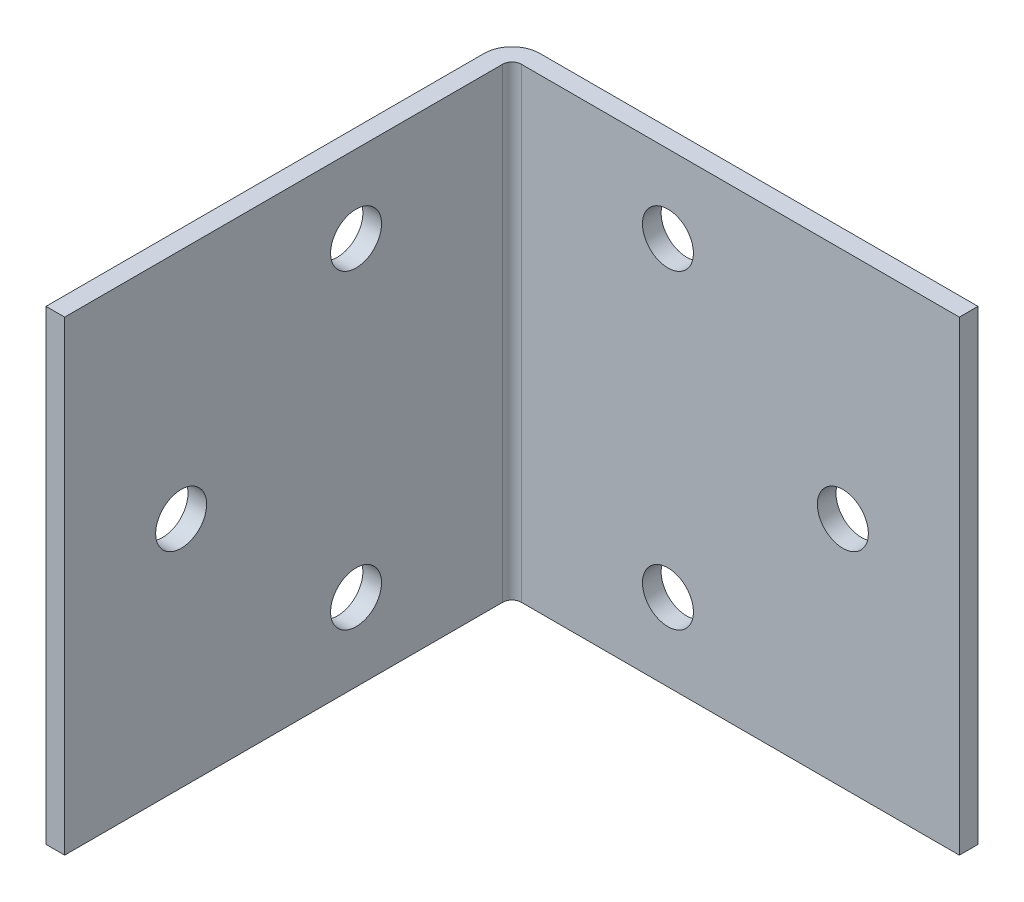
ISO-10303-21;
HEADER;
FILE_DESCRIPTION(('STEP AP214'),'2;1');
FILE_NAME('part.step','',(''),(''),'','','');
FILE_SCHEMA(('AUTOMOTIVE_DESIGN { 1 0 10303 214 1 1 1 1 }'));
ENDSEC;
DATA;
#1=APPLICATION_CONTEXT('core data for automotive mechanical design processes');
#2=APPLICATION_PROTOCOL_DEFINITION('international standard','automotive_design',2000,#1);
#3=PRODUCT_CONTEXT('',#1,'mechanical');
#4=PRODUCT('Part','Part','',(#3));
#5=PRODUCT_RELATED_PRODUCT_CATEGORY('part','',(#4));
#6=PRODUCT_DEFINITION_FORMATION('','',#4);
#7=PRODUCT_DEFINITION_CONTEXT('part definition',#1,'design');
#8=PRODUCT_DEFINITION('design','',#6,#7);
#9=PRODUCT_DEFINITION_SHAPE('','',#8);
#10=(LENGTH_UNIT() NAMED_UNIT(*) SI_UNIT(.MILLI.,.METRE.));
#11=(NAMED_UNIT(*) PLANE_ANGLE_UNIT() SI_UNIT($,.RADIAN.));
#12=(NAMED_UNIT(*) SI_UNIT($,.STERADIAN.) SOLID_ANGLE_UNIT());
#13=UNCERTAINTY_MEASURE_WITH_UNIT(LENGTH_MEASURE(1.E-05),#10,'distance_accuracy_value','');
#14=(GEOMETRIC_REPRESENTATION_CONTEXT(3) GLOBAL_UNCERTAINTY_ASSIGNED_CONTEXT((#13)) GLOBAL_UNIT_ASSIGNED_CONTEXT((#10,
#11,#12)) REPRESENTATION_CONTEXT('',''));
#15=CARTESIAN_POINT('',(0.,0.,0.));
#16=DIRECTION('',(0.,0.,1.));
#17=DIRECTION('',(1.,0.,0.));
#18=AXIS2_PLACEMENT_3D('',#15,#16,#17);
#19=CARTESIAN_POINT('',(2.286,19.05,1.524));
#20=DIRECTION('',(0.,0.,-1.));
#21=DIRECTION('',(-1.,0.,0.));
#22=AXIS2_PLACEMENT_3D('',#19,#20,#21);
#23=PLANE('',#22);
#24=CARTESIAN_POINT('',(14.2748,12.7,1.52400000000005));
#25=DIRECTION('',(0.,0.,-1.));
#26=DIRECTION('',(-1.,0.,0.));
#27=AXIS2_PLACEMENT_3D('',#24,#25,#26);
#28=CIRCLE('',#27,2.0828);
#29=CARTESIAN_POINT('',(12.192,12.7,1.52400000000004));
#30=VERTEX_POINT('',#29);
#31=EDGE_CURVE('E203',#30,#30,#28,.T.);
#32=ORIENTED_EDGE('',*,*,#31,.T.);
#33=EDGE_LOOP('',(#32));
#34=FACE_BOUND('',#33,.T.);
#35=DIRECTION('',(1.,0.,0.));
#36=VECTOR('',#35,1.);
#37=CARTESIAN_POINT('',(2.286,-19.05,1.524));
#38=LINE('',#37,#36);
#39=CARTESIAN_POINT('',(2.286,-19.05,1.524));
#40=VERTEX_POINT('',#39);
#41=CARTESIAN_POINT('',(38.1,-19.05,1.524));
#42=VERTEX_POINT('',#41);
#43=EDGE_CURVE('E130',#40,#42,#38,.T.);
#44=ORIENTED_EDGE('',*,*,#43,.T.);
#45=DIRECTION('',(0.,-1.,0.));
#46=VECTOR('',#45,1.);
#47=CARTESIAN_POINT('',(38.1,19.05,1.524));
#48=LINE('',#47,#46);
#49=CARTESIAN_POINT('',(38.1,19.05,1.524));
#50=VERTEX_POINT('',#49);
#51=EDGE_CURVE('E11',#50,#42,#48,.T.);
#52=ORIENTED_EDGE('',*,*,#51,.F.);
#53=DIRECTION('',(1.,0.,0.));
#54=VECTOR('',#53,1.);
#55=CARTESIAN_POINT('',(2.286,19.05,1.524));
#56=LINE('',#55,#54);
#57=CARTESIAN_POINT('',(2.286,19.05,1.524));
#58=VERTEX_POINT('',#57);
#59=EDGE_CURVE('E88',#58,#50,#56,.T.);
#60=ORIENTED_EDGE('',*,*,#59,.F.);
#61=DIRECTION('',(0.,-1.,0.));
#62=VECTOR('',#61,1.);
#63=CARTESIAN_POINT('',(2.286,19.05,1.524));
#64=LINE('',#63,#62);
#65=EDGE_CURVE('E129',#58,#40,#64,.T.);
#66=ORIENTED_EDGE('',*,*,#65,.T.);
#67=EDGE_LOOP('',(#44,#52,#60,#66));
#68=FACE_BOUND('',#67,.T.);
#69=CARTESIAN_POINT('',(28.575,0.,1.52400000000009));
#70=DIRECTION('',(0.,0.,-1.));
#71=DIRECTION('',(-1.,0.,0.));
#72=AXIS2_PLACEMENT_3D('',#69,#70,#71);
#73=CIRCLE('',#72,2.0828);
#74=CARTESIAN_POINT('',(26.4922,0.,1.52400000000009));
#75=VERTEX_POINT('',#74);
#76=EDGE_CURVE('E197',#75,#75,#73,.T.);
#77=ORIENTED_EDGE('',*,*,#76,.T.);
#78=EDGE_LOOP('',(#77));
#79=FACE_BOUND('',#78,.T.);
#80=CARTESIAN_POINT('',(14.2748,-12.7,1.52400000000005));
#81=DIRECTION('',(0.,0.,-1.));
#82=DIRECTION('',(-1.,0.,0.));
#83=AXIS2_PLACEMENT_3D('',#80,#81,#82);
#84=CIRCLE('',#83,2.0828);
#85=CARTESIAN_POINT('',(12.192,-12.7,1.52400000000004));
#86=VERTEX_POINT('',#85);
#87=EDGE_CURVE('E209',#86,#86,#84,.T.);
#88=ORIENTED_EDGE('',*,*,#87,.T.);
#89=EDGE_LOOP('',(#88));
#90=FACE_BOUND('',#89,.T.);
#91=ADVANCED_FACE('F33',(#34,#68,#79,#90),#23,.F.);
#92=CARTESIAN_POINT('',(2.286,19.05,0.));
#93=DIRECTION('',(0.,0.,-1.));
#94=DIRECTION('',(-1.,0.,0.));
#95=AXIS2_PLACEMENT_3D('',#92,#93,#94);
#96=PLANE('',#95);
#97=CARTESIAN_POINT('',(14.2748,12.7,0.));
#98=DIRECTION('',(0.,0.,-1.));
#99=DIRECTION('',(-1.,0.,0.));
#100=AXIS2_PLACEMENT_3D('',#97,#98,#99);
#101=CIRCLE('',#100,2.0828);
#102=CARTESIAN_POINT('',(12.192,12.7,0.));
#103=VERTEX_POINT('',#102);
#104=EDGE_CURVE('E200',#103,#103,#101,.T.);
#105=ORIENTED_EDGE('',*,*,#104,.F.);
#106=EDGE_LOOP('',(#105));
#107=FACE_BOUND('',#106,.T.);
#108=DIRECTION('',(1.,0.,0.));
#109=VECTOR('',#108,1.);
#110=CARTESIAN_POINT('',(2.286,-19.05,0.));
#111=LINE('',#110,#109);
#112=CARTESIAN_POINT('',(2.286,-19.05,0.));
#113=VERTEX_POINT('',#112);
#114=CARTESIAN_POINT('',(38.1,-19.05,0.));
#115=VERTEX_POINT('',#114);
#116=EDGE_CURVE('E137',#113,#115,#111,.T.);
#117=ORIENTED_EDGE('',*,*,#116,.F.);
#118=DIRECTION('',(0.,-1.,0.));
#119=VECTOR('',#118,1.);
#120=CARTESIAN_POINT('',(2.286,19.05,0.));
#121=LINE('',#120,#119);
#122=CARTESIAN_POINT('',(2.286,19.05,0.));
#123=VERTEX_POINT('',#122);
#124=EDGE_CURVE('E154',#123,#113,#121,.T.);
#125=ORIENTED_EDGE('',*,*,#124,.F.);
#126=DIRECTION('',(1.,0.,0.));
#127=VECTOR('',#126,1.);
#128=CARTESIAN_POINT('',(2.286,19.05,0.));
#129=LINE('',#128,#127);
#130=CARTESIAN_POINT('',(38.1,19.05,0.));
#131=VERTEX_POINT('',#130);
#132=EDGE_CURVE('E162',#123,#131,#129,.T.);
#133=ORIENTED_EDGE('',*,*,#132,.T.);
#134=DIRECTION('',(0.,-1.,0.));
#135=VECTOR('',#134,1.);
#136=CARTESIAN_POINT('',(38.1,19.05,0.));
#137=LINE('',#136,#135);
#138=EDGE_CURVE('E41',#131,#115,#137,.T.);
#139=ORIENTED_EDGE('',*,*,#138,.T.);
#140=EDGE_LOOP('',(#117,#125,#133,#139));
#141=FACE_BOUND('',#140,.T.);
#142=CARTESIAN_POINT('',(28.575,0.,0.));
#143=DIRECTION('',(0.,0.,-1.));
#144=DIRECTION('',(-1.,0.,0.));
#145=AXIS2_PLACEMENT_3D('',#142,#143,#144);
#146=CIRCLE('',#145,2.0828);
#147=CARTESIAN_POINT('',(26.4922,0.,0.));
#148=VERTEX_POINT('',#147);
#149=EDGE_CURVE('E194',#148,#148,#146,.T.);
#150=ORIENTED_EDGE('',*,*,#149,.F.);
#151=EDGE_LOOP('',(#150));
#152=FACE_BOUND('',#151,.T.);
#153=CARTESIAN_POINT('',(14.2748,-12.7,0.));
#154=DIRECTION('',(0.,0.,-1.));
#155=DIRECTION('',(-1.,0.,0.));
#156=AXIS2_PLACEMENT_3D('',#153,#154,#155);
#157=CIRCLE('',#156,2.0828);
#158=CARTESIAN_POINT('',(12.192,-12.7,0.));
#159=VERTEX_POINT('',#158);
#160=EDGE_CURVE('E206',#159,#159,#157,.T.);
#161=ORIENTED_EDGE('',*,*,#160,.F.);
#162=EDGE_LOOP('',(#161));
#163=FACE_BOUND('',#162,.T.);
#164=ADVANCED_FACE('F159',(#107,#141,#152,#163),#96,.T.);
#165=CARTESIAN_POINT('',(38.1,19.05,0.));
#166=DIRECTION('',(1.,0.,0.));
#167=DIRECTION('',(0.,0.,-1.));
#168=AXIS2_PLACEMENT_3D('',#165,#166,#167);
#169=PLANE('',#168);
#170=DIRECTION('',(0.,0.,1.));
#171=VECTOR('',#170,1.);
#172=CARTESIAN_POINT('',(38.1,-19.05,0.));
#173=LINE('',#172,#171);
#174=EDGE_CURVE('E133',#115,#42,#173,.T.);
#175=ORIENTED_EDGE('',*,*,#174,.F.);
#176=ORIENTED_EDGE('',*,*,#138,.F.);
#177=DIRECTION('',(0.,0.,1.));
#178=VECTOR('',#177,1.);
#179=CARTESIAN_POINT('',(38.1,19.05,0.));
#180=LINE('',#179,#178);
#181=EDGE_CURVE('E174',#131,#50,#180,.T.);
#182=ORIENTED_EDGE('',*,*,#181,.T.);
#183=ORIENTED_EDGE('',*,*,#51,.T.);
#184=EDGE_LOOP('',(#175,#176,#182,#183));
#185=FACE_BOUND('',#184,.T.);
#186=ADVANCED_FACE('F165',(#185),#169,.T.);
#187=CARTESIAN_POINT('',(2.286,19.05,2.286));
#188=DIRECTION('',(0.,-1.,0.));
#189=DIRECTION('',(0.,0.,-1.));
#190=AXIS2_PLACEMENT_3D('',#187,#188,#189);
#191=CYLINDRICAL_SURFACE('',#190,2.286);
#192=CARTESIAN_POINT('',(2.286,-19.05,2.286));
#193=DIRECTION('',(0.,-1.,0.));
#194=DIRECTION('',(0.,0.,1.));
#195=AXIS2_PLACEMENT_3D('',#192,#193,#194);
#196=CIRCLE('',#195,2.286);
#197=CARTESIAN_POINT('',(0.,-19.05,2.286));
#198=VERTEX_POINT('',#197);
#199=EDGE_CURVE('E140',#198,#113,#196,.T.);
#200=ORIENTED_EDGE('',*,*,#199,.F.);
#201=DIRECTION('',(0.,-1.,0.));
#202=VECTOR('',#201,1.);
#203=CARTESIAN_POINT('',(0.,19.05,2.286));
#204=LINE('',#203,#202);
#205=CARTESIAN_POINT('',(0.,19.05,2.286));
#206=VERTEX_POINT('',#205);
#207=EDGE_CURVE('E152',#206,#198,#204,.T.);
#208=ORIENTED_EDGE('',*,*,#207,.F.);
#209=CARTESIAN_POINT('',(2.286,19.05,2.286));
#210=DIRECTION('',(0.,-1.,0.));
#211=DIRECTION('',(0.,0.,1.));
#212=AXIS2_PLACEMENT_3D('',#209,#210,#211);
#213=CIRCLE('',#212,2.286);
#214=EDGE_CURVE('E124',#206,#123,#213,.T.);
#215=ORIENTED_EDGE('',*,*,#214,.T.);
#216=ORIENTED_EDGE('',*,*,#124,.T.);
#217=EDGE_LOOP('',(#200,#208,#215,#216));
#218=FACE_BOUND('',#217,.T.);
#219=ADVANCED_FACE('F172',(#218),#191,.T.);
#220=CARTESIAN_POINT('',(0.,19.05,38.1));
#221=DIRECTION('',(-1.,0.,0.));
#222=DIRECTION('',(0.,0.,1.));
#223=AXIS2_PLACEMENT_3D('',#220,#221,#222);
#224=PLANE('',#223);
#225=CARTESIAN_POINT('',(0.,-12.7,14.2748));
#226=DIRECTION('',(1.,0.,0.));
#227=DIRECTION('',(0.,0.,-1.));
#228=AXIS2_PLACEMENT_3D('',#225,#226,#227);
#229=CIRCLE('',#228,2.0828);
#230=CARTESIAN_POINT('',(0.,-12.7,12.192));
#231=VERTEX_POINT('',#230);
#232=EDGE_CURVE('E188',#231,#231,#229,.T.);
#233=ORIENTED_EDGE('',*,*,#232,.T.);
#234=EDGE_LOOP('',(#233));
#235=FACE_BOUND('',#234,.T.);
#236=CARTESIAN_POINT('',(0.,12.7,14.2748));
#237=DIRECTION('',(1.,0.,0.));
#238=DIRECTION('',(0.,0.,-1.));
#239=AXIS2_PLACEMENT_3D('',#236,#237,#238);
#240=CIRCLE('',#239,2.0828);
#241=CARTESIAN_POINT('',(0.,12.7,12.192));
#242=VERTEX_POINT('',#241);
#243=EDGE_CURVE('E182',#242,#242,#240,.T.);
#244=ORIENTED_EDGE('',*,*,#243,.T.);
#245=EDGE_LOOP('',(#244));
#246=FACE_BOUND('',#245,.T.);
#247=CARTESIAN_POINT('',(0.,0.,28.575));
#248=DIRECTION('',(1.,0.,0.));
#249=DIRECTION('',(0.,0.,-1.));
#250=AXIS2_PLACEMENT_3D('',#247,#248,#249);
#251=CIRCLE('',#250,2.0828);
#252=CARTESIAN_POINT('',(0.,0.,26.4922));
#253=VERTEX_POINT('',#252);
#254=EDGE_CURVE('E134',#253,#253,#251,.T.);
#255=ORIENTED_EDGE('',*,*,#254,.T.);
#256=EDGE_LOOP('',(#255));
#257=FACE_BOUND('',#256,.T.);
#258=DIRECTION('',(0.,0.,-1.));
#259=VECTOR('',#258,1.);
#260=CARTESIAN_POINT('',(0.,-19.05,38.1));
#261=LINE('',#260,#259);
#262=CARTESIAN_POINT('',(0.,-19.05,38.1));
#263=VERTEX_POINT('',#262);
#264=EDGE_CURVE('E143',#263,#198,#261,.T.);
#265=ORIENTED_EDGE('',*,*,#264,.F.);
#266=DIRECTION('',(0.,-1.,0.));
#267=VECTOR('',#266,1.);
#268=CARTESIAN_POINT('',(0.,19.05,38.1));
#269=LINE('',#268,#267);
#270=CARTESIAN_POINT('',(0.,19.05,38.1));
#271=VERTEX_POINT('',#270);
#272=EDGE_CURVE('E112',#271,#263,#269,.T.);
#273=ORIENTED_EDGE('',*,*,#272,.F.);
#274=DIRECTION('',(0.,0.,-1.));
#275=VECTOR('',#274,1.);
#276=CARTESIAN_POINT('',(0.,19.05,38.1));
#277=LINE('',#276,#275);
#278=EDGE_CURVE('E122',#271,#206,#277,.T.);
#279=ORIENTED_EDGE('',*,*,#278,.T.);
#280=ORIENTED_EDGE('',*,*,#207,.T.);
#281=EDGE_LOOP('',(#265,#273,#279,#280));
#282=FACE_BOUND('',#281,.T.);
#283=ADVANCED_FACE('F230',(#235,#246,#257,#282),#224,.T.);
#284=CARTESIAN_POINT('',(1.524,19.05,38.1));
#285=DIRECTION('',(0.,0.,1.));
#286=DIRECTION('',(1.,0.,0.));
#287=AXIS2_PLACEMENT_3D('',#284,#285,#286);
#288=PLANE('',#287);
#289=DIRECTION('',(-1.,0.,0.));
#290=VECTOR('',#289,1.);
#291=CARTESIAN_POINT('',(1.524,-19.05,38.1));
#292=LINE('',#291,#290);
#293=CARTESIAN_POINT('',(1.524,-19.05,38.1));
#294=VERTEX_POINT('',#293);
#295=EDGE_CURVE('E111',#294,#263,#292,.T.);
#296=ORIENTED_EDGE('',*,*,#295,.F.);
#297=DIRECTION('',(0.,-1.,0.));
#298=VECTOR('',#297,1.);
#299=CARTESIAN_POINT('',(1.524,19.05,38.1));
#300=LINE('',#299,#298);
#301=CARTESIAN_POINT('',(1.524,19.05,38.1));
#302=VERTEX_POINT('',#301);
#303=EDGE_CURVE('E105',#302,#294,#300,.T.);
#304=ORIENTED_EDGE('',*,*,#303,.F.);
#305=DIRECTION('',(-1.,0.,0.));
#306=VECTOR('',#305,1.);
#307=CARTESIAN_POINT('',(1.524,19.05,38.1));
#308=LINE('',#307,#306);
#309=EDGE_CURVE('E109',#302,#271,#308,.T.);
#310=ORIENTED_EDGE('',*,*,#309,.T.);
#311=ORIENTED_EDGE('',*,*,#272,.T.);
#312=EDGE_LOOP('',(#296,#304,#310,#311));
#313=FACE_BOUND('',#312,.T.);
#314=ADVANCED_FACE('F107',(#313),#288,.T.);
#315=CARTESIAN_POINT('',(1.524,19.05,38.1));
#316=DIRECTION('',(-1.,0.,0.));
#317=DIRECTION('',(0.,0.,1.));
#318=AXIS2_PLACEMENT_3D('',#315,#316,#317);
#319=PLANE('',#318);
#320=CARTESIAN_POINT('',(1.524,-12.7,14.2748));
#321=DIRECTION('',(1.,0.,0.));
#322=DIRECTION('',(0.,0.,-1.));
#323=AXIS2_PLACEMENT_3D('',#320,#321,#322);
#324=CIRCLE('',#323,2.0828);
#325=CARTESIAN_POINT('',(1.524,-12.7,12.192));
#326=VERTEX_POINT('',#325);
#327=EDGE_CURVE('E191',#326,#326,#324,.T.);
#328=ORIENTED_EDGE('',*,*,#327,.F.);
#329=EDGE_LOOP('',(#328));
#330=FACE_BOUND('',#329,.T.);
#331=CARTESIAN_POINT('',(1.524,12.7,14.2748));
#332=DIRECTION('',(1.,0.,0.));
#333=DIRECTION('',(0.,0.,-1.));
#334=AXIS2_PLACEMENT_3D('',#331,#332,#333);
#335=CIRCLE('',#334,2.0828);
#336=CARTESIAN_POINT('',(1.524,12.7,12.192));
#337=VERTEX_POINT('',#336);
#338=EDGE_CURVE('E185',#337,#337,#335,.T.);
#339=ORIENTED_EDGE('',*,*,#338,.F.);
#340=EDGE_LOOP('',(#339));
#341=FACE_BOUND('',#340,.T.);
#342=CARTESIAN_POINT('',(1.524,0.,28.575));
#343=DIRECTION('',(1.,0.,0.));
#344=DIRECTION('',(0.,0.,-1.));
#345=AXIS2_PLACEMENT_3D('',#342,#343,#344);
#346=CIRCLE('',#345,2.0828);
#347=CARTESIAN_POINT('',(1.524,0.,26.4922));
#348=VERTEX_POINT('',#347);
#349=EDGE_CURVE('E179',#348,#348,#346,.T.);
#350=ORIENTED_EDGE('',*,*,#349,.F.);
#351=EDGE_LOOP('',(#350));
#352=FACE_BOUND('',#351,.T.);
#353=DIRECTION('',(0.,0.,-1.));
#354=VECTOR('',#353,1.);
#355=CARTESIAN_POINT('',(1.524,-19.05,38.1));
#356=LINE('',#355,#354);
#357=CARTESIAN_POINT('',(1.524,-19.05,2.286));
#358=VERTEX_POINT('',#357);
#359=EDGE_CURVE('E76',#294,#358,#356,.T.);
#360=ORIENTED_EDGE('',*,*,#359,.T.);
#361=DIRECTION('',(0.,-1.,0.));
#362=VECTOR('',#361,1.);
#363=CARTESIAN_POINT('',(1.524,19.05,2.286));
#364=LINE('',#363,#362);
#365=CARTESIAN_POINT('',(1.524,19.05,2.286));
#366=VERTEX_POINT('',#365);
#367=EDGE_CURVE('E113',#366,#358,#364,.T.);
#368=ORIENTED_EDGE('',*,*,#367,.F.);
#369=DIRECTION('',(0.,0.,-1.));
#370=VECTOR('',#369,1.);
#371=CARTESIAN_POINT('',(1.524,19.05,38.1));
#372=LINE('',#371,#370);
#373=EDGE_CURVE('E115',#302,#366,#372,.T.);
#374=ORIENTED_EDGE('',*,*,#373,.F.);
#375=ORIENTED_EDGE('',*,*,#303,.T.);
#376=EDGE_LOOP('',(#360,#368,#374,#375));
#377=FACE_BOUND('',#376,.T.);
#378=ADVANCED_FACE('F116',(#330,#341,#352,#377),#319,.F.);
#379=CARTESIAN_POINT('',(2.286,19.05,2.286));
#380=DIRECTION('',(0.,-1.,0.));
#381=DIRECTION('',(0.,0.,-1.));
#382=AXIS2_PLACEMENT_3D('',#379,#380,#381);
#383=CYLINDRICAL_SURFACE('',#382,0.762);
#384=CARTESIAN_POINT('',(2.286,-19.05,2.286));
#385=DIRECTION('',(0.,1.,0.));
#386=DIRECTION('',(1.,0.,0.));
#387=AXIS2_PLACEMENT_3D('',#384,#385,#386);
#388=CIRCLE('',#387,0.762);
#389=EDGE_CURVE('E82',#358,#40,#388,.F.);
#390=ORIENTED_EDGE('',*,*,#389,.T.);
#391=ORIENTED_EDGE('',*,*,#65,.F.);
#392=CARTESIAN_POINT('',(2.286,19.05,2.286));
#393=DIRECTION('',(0.,1.,0.));
#394=DIRECTION('',(1.,0.,0.));
#395=AXIS2_PLACEMENT_3D('',#392,#393,#394);
#396=CIRCLE('',#395,0.762);
#397=EDGE_CURVE('E49',#366,#58,#396,.F.);
#398=ORIENTED_EDGE('',*,*,#397,.F.);
#399=ORIENTED_EDGE('',*,*,#367,.T.);
#400=EDGE_LOOP('',(#390,#391,#398,#399));
#401=FACE_BOUND('',#400,.T.);
#402=ADVANCED_FACE('F238',(#401),#383,.F.);
#403=CARTESIAN_POINT('',(2.286,19.05,2.286));
#404=DIRECTION('',(0.,-1.,0.));
#405=DIRECTION('',(-1.,0.,0.));
#406=AXIS2_PLACEMENT_3D('',#403,#404,#405);
#407=PLANE('',#406);
#408=ORIENTED_EDGE('',*,*,#59,.T.);
#409=ORIENTED_EDGE('',*,*,#181,.F.);
#410=ORIENTED_EDGE('',*,*,#132,.F.);
#411=ORIENTED_EDGE('',*,*,#214,.F.);
#412=ORIENTED_EDGE('',*,*,#278,.F.);
#413=ORIENTED_EDGE('',*,*,#309,.F.);
#414=ORIENTED_EDGE('',*,*,#373,.T.);
#415=ORIENTED_EDGE('',*,*,#397,.T.);
#416=EDGE_LOOP('',(#408,#409,#410,#411,#412,#413,#414,#415));
#417=FACE_BOUND('',#416,.T.);
#418=ADVANCED_FACE('F119',(#417),#407,.F.);
#419=CARTESIAN_POINT('',(2.286,-19.05,2.286));
#420=DIRECTION('',(0.,-1.,0.));
#421=DIRECTION('',(-1.,0.,0.));
#422=AXIS2_PLACEMENT_3D('',#419,#420,#421);
#423=PLANE('',#422);
#424=ORIENTED_EDGE('',*,*,#43,.F.);
#425=ORIENTED_EDGE('',*,*,#389,.F.);
#426=ORIENTED_EDGE('',*,*,#359,.F.);
#427=ORIENTED_EDGE('',*,*,#295,.T.);
#428=ORIENTED_EDGE('',*,*,#264,.T.);
#429=ORIENTED_EDGE('',*,*,#199,.T.);
#430=ORIENTED_EDGE('',*,*,#116,.T.);
#431=ORIENTED_EDGE('',*,*,#174,.T.);
#432=EDGE_LOOP('',(#424,#425,#426,#427,#428,#429,#430,#431));
#433=FACE_BOUND('',#432,.T.);
#434=ADVANCED_FACE('F168',(#433),#423,.T.);
#435=CARTESIAN_POINT('',(0.,0.,28.575));
#436=DIRECTION('',(1.,0.,0.));
#437=DIRECTION('',(0.,0.,-1.));
#438=AXIS2_PLACEMENT_3D('',#435,#436,#437);
#439=CYLINDRICAL_SURFACE('',#438,2.0828);
#440=ORIENTED_EDGE('',*,*,#254,.F.);
#441=EDGE_LOOP('',(#440));
#442=FACE_BOUND('',#441,.T.);
#443=ORIENTED_EDGE('',*,*,#349,.T.);
#444=EDGE_LOOP('',(#443));
#445=FACE_BOUND('',#444,.T.);
#446=ADVANCED_FACE('F244',(#442,#445),#439,.F.);
#447=CARTESIAN_POINT('',(0.,12.7,14.2748));
#448=DIRECTION('',(1.,0.,0.));
#449=DIRECTION('',(0.,0.,-1.));
#450=AXIS2_PLACEMENT_3D('',#447,#448,#449);
#451=CYLINDRICAL_SURFACE('',#450,2.0828);
#452=ORIENTED_EDGE('',*,*,#243,.F.);
#453=EDGE_LOOP('',(#452));
#454=FACE_BOUND('',#453,.T.);
#455=ORIENTED_EDGE('',*,*,#338,.T.);
#456=EDGE_LOOP('',(#455));
#457=FACE_BOUND('',#456,.T.);
#458=ADVANCED_FACE('F249',(#454,#457),#451,.F.);
#459=CARTESIAN_POINT('',(0.,-12.7,14.2748));
#460=DIRECTION('',(1.,0.,0.));
#461=DIRECTION('',(0.,0.,-1.));
#462=AXIS2_PLACEMENT_3D('',#459,#460,#461);
#463=CYLINDRICAL_SURFACE('',#462,2.0828);
#464=ORIENTED_EDGE('',*,*,#232,.F.);
#465=EDGE_LOOP('',(#464));
#466=FACE_BOUND('',#465,.T.);
#467=ORIENTED_EDGE('',*,*,#327,.T.);
#468=EDGE_LOOP('',(#467));
#469=FACE_BOUND('',#468,.T.);
#470=ADVANCED_FACE('F253',(#466,#469),#463,.F.);
#471=CARTESIAN_POINT('',(28.575,0.,0.));
#472=DIRECTION('',(0.,0.,1.));
#473=DIRECTION('',(1.,0.,0.));
#474=AXIS2_PLACEMENT_3D('',#471,#472,#473);
#475=CYLINDRICAL_SURFACE('',#474,2.0828);
#476=ORIENTED_EDGE('',*,*,#149,.T.);
#477=EDGE_LOOP('',(#476));
#478=FACE_BOUND('',#477,.T.);
#479=ORIENTED_EDGE('',*,*,#76,.F.);
#480=EDGE_LOOP('',(#479));
#481=FACE_BOUND('',#480,.T.);
#482=ADVANCED_FACE('F257',(#478,#481),#475,.F.);
#483=CARTESIAN_POINT('',(14.2748,12.7,0.));
#484=DIRECTION('',(0.,0.,1.));
#485=DIRECTION('',(1.,0.,0.));
#486=AXIS2_PLACEMENT_3D('',#483,#484,#485);
#487=CYLINDRICAL_SURFACE('',#486,2.0828);
#488=ORIENTED_EDGE('',*,*,#104,.T.);
#489=EDGE_LOOP('',(#488));
#490=FACE_BOUND('',#489,.T.);
#491=ORIENTED_EDGE('',*,*,#31,.F.);
#492=EDGE_LOOP('',(#491));
#493=FACE_BOUND('',#492,.T.);
#494=ADVANCED_FACE('F261',(#490,#493),#487,.F.);
#495=CARTESIAN_POINT('',(14.2748,-12.7,0.));
#496=DIRECTION('',(0.,0.,1.));
#497=DIRECTION('',(1.,0.,0.));
#498=AXIS2_PLACEMENT_3D('',#495,#496,#497);
#499=CYLINDRICAL_SURFACE('',#498,2.0828);
#500=ORIENTED_EDGE('',*,*,#160,.T.);
#501=EDGE_LOOP('',(#500));
#502=FACE_BOUND('',#501,.T.);
#503=ORIENTED_EDGE('',*,*,#87,.F.);
#504=EDGE_LOOP('',(#503));
#505=FACE_BOUND('',#504,.T.);
#506=ADVANCED_FACE('F215',(#502,#505),#499,.F.);
#507=CLOSED_SHELL('',(#91,#164,#186,#219,#283,#314,#378,#402,#418,#434,#446,#458,#470,#482,#494,#506));
#508=MANIFOLD_SOLID_BREP('B2',#507);
#509=ADVANCED_BREP_SHAPE_REPRESENTATION('',(#18,#508),#14);
#510=SHAPE_DEFINITION_REPRESENTATION(#9,#509);
ENDSEC;
END-ISO-10303-21;
